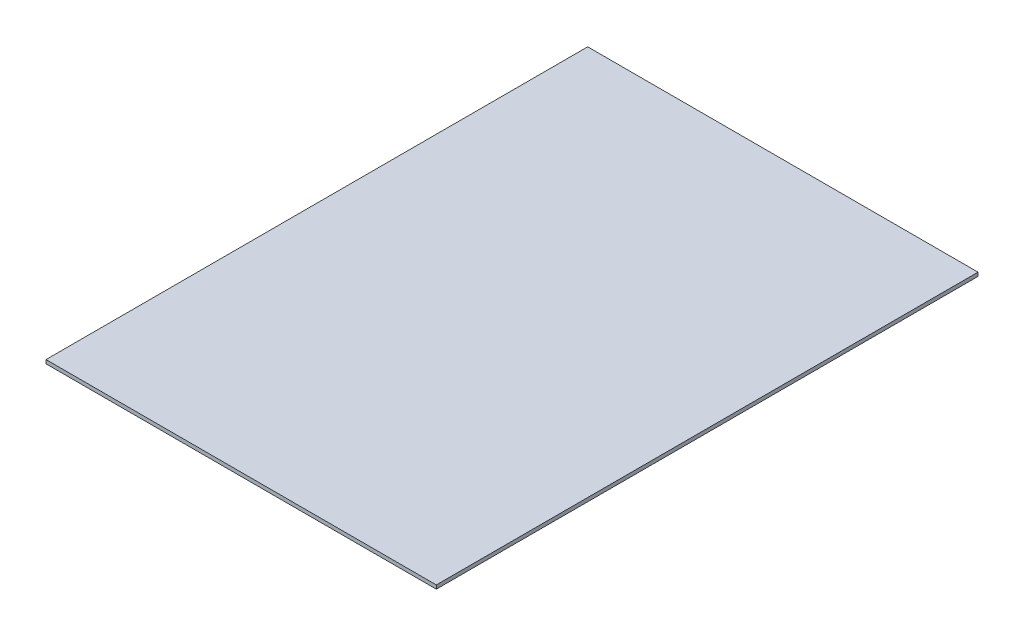
ISO-10303-21;
HEADER;
FILE_DESCRIPTION(('STEP AP214'),'2;1');
FILE_NAME('part.step','',(''),(''),'','','');
FILE_SCHEMA(('AUTOMOTIVE_DESIGN { 1 0 10303 214 1 1 1 1 }'));
ENDSEC;
DATA;
#1=APPLICATION_CONTEXT('core data for automotive mechanical design processes');
#2=APPLICATION_PROTOCOL_DEFINITION('international standard','automotive_design',2000,#1);
#3=PRODUCT_CONTEXT('',#1,'mechanical');
#4=PRODUCT('Part','Part','',(#3));
#5=PRODUCT_RELATED_PRODUCT_CATEGORY('part','',(#4));
#6=PRODUCT_DEFINITION_FORMATION('','',#4);
#7=PRODUCT_DEFINITION_CONTEXT('part definition',#1,'design');
#8=PRODUCT_DEFINITION('design','',#6,#7);
#9=PRODUCT_DEFINITION_SHAPE('','',#8);
#10=(LENGTH_UNIT() NAMED_UNIT(*) SI_UNIT(.MILLI.,.METRE.));
#11=(NAMED_UNIT(*) PLANE_ANGLE_UNIT() SI_UNIT($,.RADIAN.));
#12=(NAMED_UNIT(*) SI_UNIT($,.STERADIAN.) SOLID_ANGLE_UNIT());
#13=UNCERTAINTY_MEASURE_WITH_UNIT(LENGTH_MEASURE(1.E-05),#10,'distance_accuracy_value','');
#14=(GEOMETRIC_REPRESENTATION_CONTEXT(3) GLOBAL_UNCERTAINTY_ASSIGNED_CONTEXT((#13)) GLOBAL_UNIT_ASSIGNED_CONTEXT((#10,
#11,#12)) REPRESENTATION_CONTEXT('',''));
#15=CARTESIAN_POINT('',(0.,0.,0.));
#16=DIRECTION('',(0.,0.,1.));
#17=DIRECTION('',(1.,0.,0.));
#18=AXIS2_PLACEMENT_3D('',#15,#16,#17);
#19=CARTESIAN_POINT('',(66.83,0.635,-92.75));
#20=DIRECTION('',(-1.,0.,0.));
#21=DIRECTION('',(0.,0.,1.));
#22=AXIS2_PLACEMENT_3D('',#19,#20,#21);
#23=PLANE('',#22);
#24=DIRECTION('',(0.,0.,-1.));
#25=VECTOR('',#24,1.);
#26=CARTESIAN_POINT('',(66.83,-0.635,-92.75));
#27=LINE('',#26,#25);
#28=CARTESIAN_POINT('',(66.83,-0.635,92.75));
#29=VERTEX_POINT('',#28);
#30=CARTESIAN_POINT('',(66.83,-0.635,-92.75));
#31=VERTEX_POINT('',#30);
#32=EDGE_CURVE('E107',#29,#31,#27,.T.);
#33=ORIENTED_EDGE('',*,*,#32,.T.);
#34=DIRECTION('',(0.,-1.,0.));
#35=VECTOR('',#34,1.);
#36=CARTESIAN_POINT('',(66.83,0.635,-92.75));
#37=LINE('',#36,#35);
#38=CARTESIAN_POINT('',(66.83,0.635,-92.75));
#39=VERTEX_POINT('',#38);
#40=EDGE_CURVE('E11',#39,#31,#37,.T.);
#41=ORIENTED_EDGE('',*,*,#40,.F.);
#42=DIRECTION('',(0.,0.,-1.));
#43=VECTOR('',#42,1.);
#44=CARTESIAN_POINT('',(66.83,0.635,-92.75));
#45=LINE('',#44,#43);
#46=CARTESIAN_POINT('',(66.83,0.635,92.75));
#47=VERTEX_POINT('',#46);
#48=EDGE_CURVE('E91',#47,#39,#45,.T.);
#49=ORIENTED_EDGE('',*,*,#48,.F.);
#50=DIRECTION('',(0.,-1.,0.));
#51=VECTOR('',#50,1.);
#52=CARTESIAN_POINT('',(66.83,0.635,92.75));
#53=LINE('',#52,#51);
#54=EDGE_CURVE('E103',#47,#29,#53,.T.);
#55=ORIENTED_EDGE('',*,*,#54,.T.);
#56=EDGE_LOOP('',(#33,#41,#49,#55));
#57=FACE_BOUND('',#56,.T.);
#58=ADVANCED_FACE('F38',(#57),#23,.F.);
#59=CARTESIAN_POINT('',(-66.83,0.635,-92.75));
#60=DIRECTION('',(0.,0.,1.));
#61=DIRECTION('',(1.,0.,0.));
#62=AXIS2_PLACEMENT_3D('',#59,#60,#61);
#63=PLANE('',#62);
#64=DIRECTION('',(-1.,0.,0.));
#65=VECTOR('',#64,1.);
#66=CARTESIAN_POINT('',(-66.83,-0.635,-92.75));
#67=LINE('',#66,#65);
#68=CARTESIAN_POINT('',(-66.83,-0.635,-92.75));
#69=VERTEX_POINT('',#68);
#70=EDGE_CURVE('E96',#31,#69,#67,.T.);
#71=ORIENTED_EDGE('',*,*,#70,.T.);
#72=DIRECTION('',(0.,-1.,0.));
#73=VECTOR('',#72,1.);
#74=CARTESIAN_POINT('',(-66.83,0.635,-92.75));
#75=LINE('',#74,#73);
#76=CARTESIAN_POINT('',(-66.83,0.635,-92.75));
#77=VERTEX_POINT('',#76);
#78=EDGE_CURVE('E46',#77,#69,#75,.T.);
#79=ORIENTED_EDGE('',*,*,#78,.F.);
#80=DIRECTION('',(-1.,0.,0.));
#81=VECTOR('',#80,1.);
#82=CARTESIAN_POINT('',(-66.83,0.635,-92.75));
#83=LINE('',#82,#81);
#84=EDGE_CURVE('E86',#39,#77,#83,.T.);
#85=ORIENTED_EDGE('',*,*,#84,.F.);
#86=ORIENTED_EDGE('',*,*,#40,.T.);
#87=EDGE_LOOP('',(#71,#79,#85,#86));
#88=FACE_BOUND('',#87,.T.);
#89=ADVANCED_FACE('F95',(#88),#63,.F.);
#90=CARTESIAN_POINT('',(-66.83,0.635,-92.75));
#91=DIRECTION('',(1.,0.,0.));
#92=DIRECTION('',(0.,0.,-1.));
#93=AXIS2_PLACEMENT_3D('',#90,#91,#92);
#94=PLANE('',#93);
#95=DIRECTION('',(0.,0.,1.));
#96=VECTOR('',#95,1.);
#97=CARTESIAN_POINT('',(-66.83,-0.635,-92.75));
#98=LINE('',#97,#96);
#99=CARTESIAN_POINT('',(-66.83,-0.635,92.75));
#100=VERTEX_POINT('',#99);
#101=EDGE_CURVE('E73',#69,#100,#98,.T.);
#102=ORIENTED_EDGE('',*,*,#101,.T.);
#103=DIRECTION('',(0.,-1.,0.));
#104=VECTOR('',#103,1.);
#105=CARTESIAN_POINT('',(-66.83,0.635,92.75));
#106=LINE('',#105,#104);
#107=CARTESIAN_POINT('',(-66.83,0.635,92.75));
#108=VERTEX_POINT('',#107);
#109=EDGE_CURVE('E97',#108,#100,#106,.T.);
#110=ORIENTED_EDGE('',*,*,#109,.F.);
#111=DIRECTION('',(0.,0.,1.));
#112=VECTOR('',#111,1.);
#113=CARTESIAN_POINT('',(-66.83,0.635,-92.75));
#114=LINE('',#113,#112);
#115=EDGE_CURVE('E89',#77,#108,#114,.T.);
#116=ORIENTED_EDGE('',*,*,#115,.F.);
#117=ORIENTED_EDGE('',*,*,#78,.T.);
#118=EDGE_LOOP('',(#102,#110,#116,#117));
#119=FACE_BOUND('',#118,.T.);
#120=ADVANCED_FACE('F98',(#119),#94,.F.);
#121=CARTESIAN_POINT('',(-66.83,0.635,92.75));
#122=DIRECTION('',(0.,0.,-1.));
#123=DIRECTION('',(-1.,0.,0.));
#124=AXIS2_PLACEMENT_3D('',#121,#122,#123);
#125=PLANE('',#124);
#126=DIRECTION('',(1.,0.,0.));
#127=VECTOR('',#126,1.);
#128=CARTESIAN_POINT('',(-66.83,-0.635,92.75));
#129=LINE('',#128,#127);
#130=EDGE_CURVE('E79',#100,#29,#129,.T.);
#131=ORIENTED_EDGE('',*,*,#130,.T.);
#132=ORIENTED_EDGE('',*,*,#54,.F.);
#133=DIRECTION('',(1.,0.,0.));
#134=VECTOR('',#133,1.);
#135=CARTESIAN_POINT('',(-66.83,0.635,92.75));
#136=LINE('',#135,#134);
#137=EDGE_CURVE('E54',#108,#47,#136,.T.);
#138=ORIENTED_EDGE('',*,*,#137,.F.);
#139=ORIENTED_EDGE('',*,*,#109,.T.);
#140=EDGE_LOOP('',(#131,#132,#138,#139));
#141=FACE_BOUND('',#140,.T.);
#142=ADVANCED_FACE('F117',(#141),#125,.F.);
#143=CARTESIAN_POINT('',(0.,0.635,0.));
#144=DIRECTION('',(0.,1.,0.));
#145=DIRECTION('',(0.,0.,1.));
#146=AXIS2_PLACEMENT_3D('',#143,#144,#145);
#147=PLANE('',#146);
#148=ORIENTED_EDGE('',*,*,#48,.T.);
#149=ORIENTED_EDGE('',*,*,#84,.T.);
#150=ORIENTED_EDGE('',*,*,#115,.T.);
#151=ORIENTED_EDGE('',*,*,#137,.T.);
#152=EDGE_LOOP('',(#148,#149,#150,#151));
#153=FACE_BOUND('',#152,.T.);
#154=ADVANCED_FACE('F87',(#153),#147,.T.);
#155=CARTESIAN_POINT('',(0.,-0.635,0.));
#156=DIRECTION('',(0.,1.,0.));
#157=DIRECTION('',(0.,0.,1.));
#158=AXIS2_PLACEMENT_3D('',#155,#156,#157);
#159=PLANE('',#158);
#160=ORIENTED_EDGE('',*,*,#32,.F.);
#161=ORIENTED_EDGE('',*,*,#130,.F.);
#162=ORIENTED_EDGE('',*,*,#101,.F.);
#163=ORIENTED_EDGE('',*,*,#70,.F.);
#164=EDGE_LOOP('',(#160,#161,#162,#163));
#165=FACE_BOUND('',#164,.T.);
#166=ADVANCED_FACE('F120',(#165),#159,.F.);
#167=CLOSED_SHELL('',(#58,#89,#120,#142,#154,#166));
#168=MANIFOLD_SOLID_BREP('B2',#167);
#169=ADVANCED_BREP_SHAPE_REPRESENTATION('',(#18,#168),#14);
#170=SHAPE_DEFINITION_REPRESENTATION(#9,#169);
ENDSEC;
END-ISO-10303-21;
